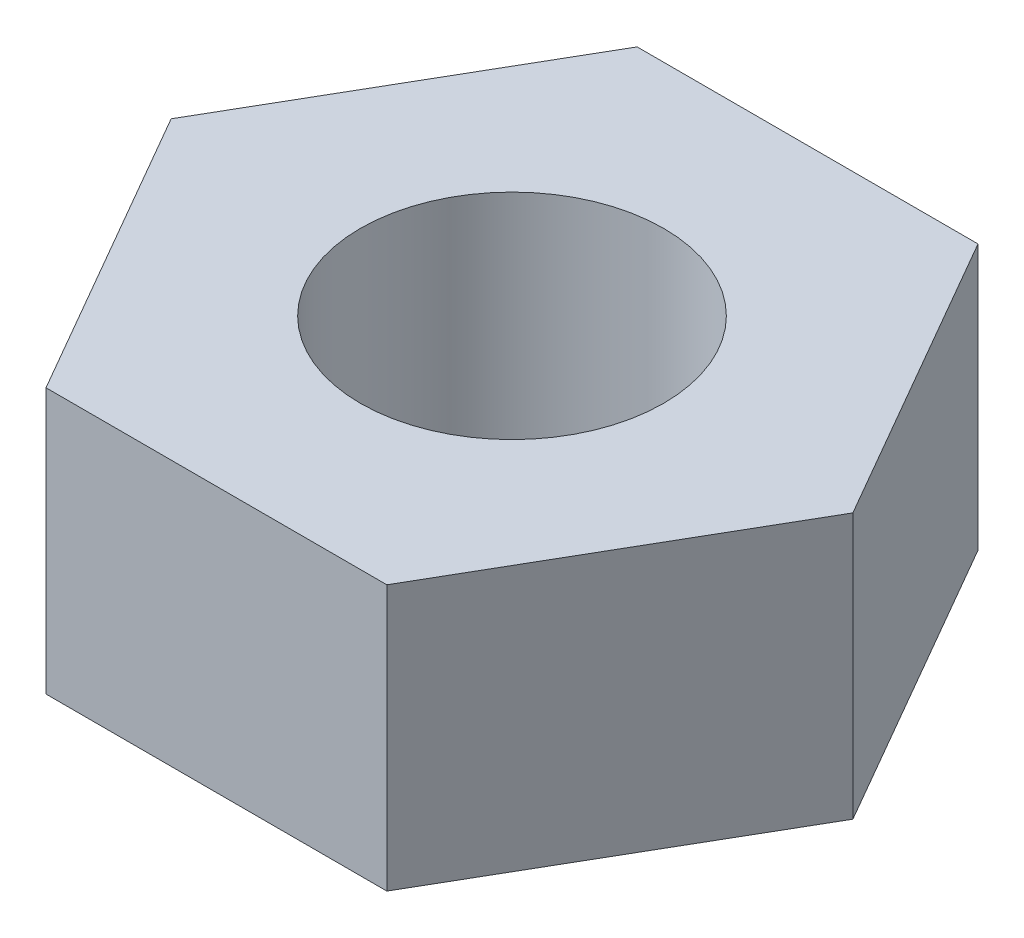
ISO-10303-21;
HEADER;
FILE_DESCRIPTION(('STEP AP214'),'2;1');
FILE_NAME('part.step','',(''),(''),'','','');
FILE_SCHEMA(('AUTOMOTIVE_DESIGN { 1 0 10303 214 1 1 1 1 }'));
ENDSEC;
DATA;
#1=APPLICATION_CONTEXT('core data for automotive mechanical design processes');
#2=APPLICATION_PROTOCOL_DEFINITION('international standard','automotive_design',2000,#1);
#3=PRODUCT_CONTEXT('',#1,'mechanical');
#4=PRODUCT('Part','Part','',(#3));
#5=PRODUCT_RELATED_PRODUCT_CATEGORY('part','',(#4));
#6=PRODUCT_DEFINITION_FORMATION('','',#4);
#7=PRODUCT_DEFINITION_CONTEXT('part definition',#1,'design');
#8=PRODUCT_DEFINITION('design','',#6,#7);
#9=PRODUCT_DEFINITION_SHAPE('','',#8);
#10=(LENGTH_UNIT() NAMED_UNIT(*) SI_UNIT(.MILLI.,.METRE.));
#11=(NAMED_UNIT(*) PLANE_ANGLE_UNIT() SI_UNIT($,.RADIAN.));
#12=(NAMED_UNIT(*) SI_UNIT($,.STERADIAN.) SOLID_ANGLE_UNIT());
#13=UNCERTAINTY_MEASURE_WITH_UNIT(LENGTH_MEASURE(1.E-05),#10,'distance_accuracy_value','');
#14=(GEOMETRIC_REPRESENTATION_CONTEXT(3) GLOBAL_UNCERTAINTY_ASSIGNED_CONTEXT((#13)) GLOBAL_UNIT_ASSIGNED_CONTEXT((#10,
#11,#12)) REPRESENTATION_CONTEXT('',''));
#15=CARTESIAN_POINT('',(0.,0.,0.));
#16=DIRECTION('',(0.,0.,1.));
#17=DIRECTION('',(1.,0.,0.));
#18=AXIS2_PLACEMENT_3D('',#15,#16,#17);
#19=CARTESIAN_POINT('',(8.99025308735562,14.,15.5940805892907));
#20=DIRECTION('',(0.,1.,0.));
#21=DIRECTION('',(0.,0.,1.));
#22=AXIS2_PLACEMENT_3D('',#19,#20,#21);
#23=PLANE('',#22);
#24=DIRECTION('',(0.99999980459252,0.,0.000625151919105333));
#25=VECTOR('',#24,1.);
#26=CARTESIAN_POINT('',(-9.00974339530973,14.,15.5828278547468));
#27=LINE('',#26,#25);
#28=CARTESIAN_POINT('',(-9.00974339530973,14.,15.5828278547468));
#29=VERTEX_POINT('',#28);
#30=CARTESIAN_POINT('',(8.99025308735562,14.,15.5940805892907));
#31=VERTEX_POINT('',#30);
#32=EDGE_CURVE('E127',#29,#31,#27,.T.);
#33=ORIENTED_EDGE('',*,*,#32,.T.);
#34=DIRECTION('',(0.500541299739429,0.,-0.865712658597044));
#35=VECTOR('',#34,1.);
#36=CARTESIAN_POINT('',(8.99025308735562,14.,15.5940805892907));
#37=LINE('',#36,#35);
#38=CARTESIAN_POINT('',(17.9999964826653,14.,0.0112527345438881));
#39=VERTEX_POINT('',#38);
#40=EDGE_CURVE('E85',#31,#39,#37,.T.);
#41=ORIENTED_EDGE('',*,*,#40,.T.);
#42=DIRECTION('',(-0.49945850485309,0.,-0.866337810516149));
#43=VECTOR('',#42,1.);
#44=CARTESIAN_POINT('',(17.9999964826653,14.,0.0112527345438881));
#45=LINE('',#44,#43);
#46=CARTESIAN_POINT('',(9.00974339530972,14.,-15.5828278547468));
#47=VERTEX_POINT('',#46);
#48=EDGE_CURVE('E98',#39,#47,#45,.T.);
#49=ORIENTED_EDGE('',*,*,#48,.T.);
#50=DIRECTION('',(-0.99999980459252,0.,-0.000625151919105237));
#51=VECTOR('',#50,1.);
#52=CARTESIAN_POINT('',(9.00974339530972,14.,-15.5828278547468));
#53=LINE('',#52,#51);
#54=CARTESIAN_POINT('',(-8.99025308735562,14.,-15.5940805892907));
#55=VERTEX_POINT('',#54);
#56=EDGE_CURVE('E92',#47,#55,#53,.T.);
#57=ORIENTED_EDGE('',*,*,#56,.T.);
#58=DIRECTION('',(-0.50054129973943,0.,0.865712658597044));
#59=VECTOR('',#58,1.);
#60=CARTESIAN_POINT('',(-8.99025308735562,14.,-15.5940805892907));
#61=LINE('',#60,#59);
#62=CARTESIAN_POINT('',(-17.9999964826653,14.,-0.011252734543889));
#63=VERTEX_POINT('',#62);
#64=EDGE_CURVE('E96',#55,#63,#61,.T.);
#65=ORIENTED_EDGE('',*,*,#64,.T.);
#66=DIRECTION('',(0.49945850485309,0.,0.86633781051615));
#67=VECTOR('',#66,1.);
#68=CARTESIAN_POINT('',(-17.9999964826653,14.,-0.011252734543889));
#69=LINE('',#68,#67);
#70=EDGE_CURVE('E48',#63,#29,#69,.T.);
#71=ORIENTED_EDGE('',*,*,#70,.T.);
#72=EDGE_LOOP('',(#33,#41,#49,#57,#65,#71));
#73=FACE_BOUND('',#72,.T.);
#74=CARTESIAN_POINT('',(0.,14.,0.));
#75=DIRECTION('',(0.,1.,0.));
#76=DIRECTION('',(0.,0.,1.));
#77=AXIS2_PLACEMENT_3D('',#74,#75,#76);
#78=CIRCLE('',#77,8.);
#79=CARTESIAN_POINT('',(0.,14.,8.));
#80=VERTEX_POINT('',#79);
#81=EDGE_CURVE('E120',#80,#80,#78,.T.);
#82=ORIENTED_EDGE('',*,*,#81,.F.);
#83=EDGE_LOOP('',(#82));
#84=FACE_BOUND('',#83,.T.);
#85=ADVANCED_FACE('F31',(#73,#84),#23,.T.);
#86=CARTESIAN_POINT('',(8.99025308735562,0.,15.5940805892907));
#87=DIRECTION('',(0.,1.,0.));
#88=DIRECTION('',(0.,0.,1.));
#89=AXIS2_PLACEMENT_3D('',#86,#87,#88);
#90=PLANE('',#89);
#91=DIRECTION('',(0.99999980459252,0.,0.000625151919105333));
#92=VECTOR('',#91,1.);
#93=CARTESIAN_POINT('',(-9.00974339530973,0.,15.5828278547468));
#94=LINE('',#93,#92);
#95=CARTESIAN_POINT('',(-9.00974339530973,0.,15.5828278547468));
#96=VERTEX_POINT('',#95);
#97=CARTESIAN_POINT('',(8.99025308735562,0.,15.5940805892907));
#98=VERTEX_POINT('',#97);
#99=EDGE_CURVE('E116',#96,#98,#94,.T.);
#100=ORIENTED_EDGE('',*,*,#99,.F.);
#101=DIRECTION('',(0.49945850485309,0.,0.86633781051615));
#102=VECTOR('',#101,1.);
#103=CARTESIAN_POINT('',(-17.9999964826653,0.,-0.011252734543889));
#104=LINE('',#103,#102);
#105=CARTESIAN_POINT('',(-17.9999964826653,0.,-0.011252734543889));
#106=VERTEX_POINT('',#105);
#107=EDGE_CURVE('E77',#106,#96,#104,.T.);
#108=ORIENTED_EDGE('',*,*,#107,.F.);
#109=DIRECTION('',(-0.50054129973943,0.,0.865712658597044));
#110=VECTOR('',#109,1.);
#111=CARTESIAN_POINT('',(-8.99025308735562,0.,-15.5940805892907));
#112=LINE('',#111,#110);
#113=CARTESIAN_POINT('',(-8.99025308735562,0.,-15.5940805892907));
#114=VERTEX_POINT('',#113);
#115=EDGE_CURVE('E71',#114,#106,#112,.T.);
#116=ORIENTED_EDGE('',*,*,#115,.F.);
#117=DIRECTION('',(-0.99999980459252,0.,-0.000625151919105237));
#118=VECTOR('',#117,1.);
#119=CARTESIAN_POINT('',(9.00974339530972,0.,-15.5828278547468));
#120=LINE('',#119,#118);
#121=CARTESIAN_POINT('',(9.00974339530972,0.,-15.5828278547468));
#122=VERTEX_POINT('',#121);
#123=EDGE_CURVE('E106',#122,#114,#120,.T.);
#124=ORIENTED_EDGE('',*,*,#123,.F.);
#125=DIRECTION('',(-0.49945850485309,0.,-0.866337810516149));
#126=VECTOR('',#125,1.);
#127=CARTESIAN_POINT('',(17.9999964826653,0.,0.0112527345438881));
#128=LINE('',#127,#126);
#129=CARTESIAN_POINT('',(17.9999964826653,0.,0.0112527345438881));
#130=VERTEX_POINT('',#129);
#131=EDGE_CURVE('E122',#130,#122,#128,.T.);
#132=ORIENTED_EDGE('',*,*,#131,.F.);
#133=DIRECTION('',(0.500541299739429,0.,-0.865712658597044));
#134=VECTOR('',#133,1.);
#135=CARTESIAN_POINT('',(8.99025308735562,0.,15.5940805892907));
#136=LINE('',#135,#134);
#137=EDGE_CURVE('E119',#98,#130,#136,.T.);
#138=ORIENTED_EDGE('',*,*,#137,.F.);
#139=EDGE_LOOP('',(#100,#108,#116,#124,#132,#138));
#140=FACE_BOUND('',#139,.T.);
#141=CARTESIAN_POINT('',(0.,0.,0.));
#142=DIRECTION('',(0.,1.,0.));
#143=DIRECTION('',(0.,0.,1.));
#144=AXIS2_PLACEMENT_3D('',#141,#142,#143);
#145=CIRCLE('',#144,8.);
#146=CARTESIAN_POINT('',(0.,0.,8.));
#147=VERTEX_POINT('',#146);
#148=EDGE_CURVE('E220',#147,#147,#145,.T.);
#149=ORIENTED_EDGE('',*,*,#148,.T.);
#150=EDGE_LOOP('',(#149));
#151=FACE_BOUND('',#150,.T.);
#152=ADVANCED_FACE('F136',(#140,#151),#90,.F.);
#153=CARTESIAN_POINT('',(-9.00974339530973,14.,15.5828278547468));
#154=DIRECTION('',(0.000625151919105333,0.,-0.99999980459252));
#155=DIRECTION('',(-0.99999980459252,0.,-0.000625151919105333));
#156=AXIS2_PLACEMENT_3D('',#153,#154,#155);
#157=PLANE('',#156);
#158=ORIENTED_EDGE('',*,*,#99,.T.);
#159=DIRECTION('',(0.,-1.,0.));
#160=VECTOR('',#159,1.);
#161=CARTESIAN_POINT('',(8.99025308735562,14.,15.5940805892907));
#162=LINE('',#161,#160);
#163=EDGE_CURVE('E11',#31,#98,#162,.T.);
#164=ORIENTED_EDGE('',*,*,#163,.F.);
#165=ORIENTED_EDGE('',*,*,#32,.F.);
#166=DIRECTION('',(0.,-1.,0.));
#167=VECTOR('',#166,1.);
#168=CARTESIAN_POINT('',(-9.00974339530973,14.,15.5828278547468));
#169=LINE('',#168,#167);
#170=EDGE_CURVE('E112',#29,#96,#169,.T.);
#171=ORIENTED_EDGE('',*,*,#170,.T.);
#172=EDGE_LOOP('',(#158,#164,#165,#171));
#173=FACE_BOUND('',#172,.T.);
#174=ADVANCED_FACE('F33',(#173),#157,.F.);
#175=CARTESIAN_POINT('',(8.99025308735562,14.,15.5940805892907));
#176=DIRECTION('',(-0.865712658597044,0.,-0.500541299739429));
#177=DIRECTION('',(-0.500541299739429,0.,0.865712658597044));
#178=AXIS2_PLACEMENT_3D('',#175,#176,#177);
#179=PLANE('',#178);
#180=ORIENTED_EDGE('',*,*,#137,.T.);
#181=DIRECTION('',(0.,-1.,0.));
#182=VECTOR('',#181,1.);
#183=CARTESIAN_POINT('',(17.9999964826653,14.,0.0112527345438881));
#184=LINE('',#183,#182);
#185=EDGE_CURVE('E40',#39,#130,#184,.T.);
#186=ORIENTED_EDGE('',*,*,#185,.F.);
#187=ORIENTED_EDGE('',*,*,#40,.F.);
#188=ORIENTED_EDGE('',*,*,#163,.T.);
#189=EDGE_LOOP('',(#180,#186,#187,#188));
#190=FACE_BOUND('',#189,.T.);
#191=ADVANCED_FACE('F161',(#190),#179,.F.);
#192=CARTESIAN_POINT('',(17.9999964826653,14.,0.0112527345438881));
#193=DIRECTION('',(-0.866337810516149,0.,0.49945850485309));
#194=DIRECTION('',(0.49945850485309,0.,0.866337810516149));
#195=AXIS2_PLACEMENT_3D('',#192,#193,#194);
#196=PLANE('',#195);
#197=ORIENTED_EDGE('',*,*,#131,.T.);
#198=DIRECTION('',(0.,-1.,0.));
#199=VECTOR('',#198,1.);
#200=CARTESIAN_POINT('',(9.00974339530972,14.,-15.5828278547468));
#201=LINE('',#200,#199);
#202=EDGE_CURVE('E107',#47,#122,#201,.T.);
#203=ORIENTED_EDGE('',*,*,#202,.F.);
#204=ORIENTED_EDGE('',*,*,#48,.F.);
#205=ORIENTED_EDGE('',*,*,#185,.T.);
#206=EDGE_LOOP('',(#197,#203,#204,#205));
#207=FACE_BOUND('',#206,.T.);
#208=ADVANCED_FACE('F133',(#207),#196,.F.);
#209=CARTESIAN_POINT('',(9.00974339530972,14.,-15.5828278547468));
#210=DIRECTION('',(-0.000625151919105237,0.,0.99999980459252));
#211=DIRECTION('',(0.99999980459252,0.,0.000625151919105237));
#212=AXIS2_PLACEMENT_3D('',#209,#210,#211);
#213=PLANE('',#212);
#214=ORIENTED_EDGE('',*,*,#123,.T.);
#215=DIRECTION('',(0.,-1.,0.));
#216=VECTOR('',#215,1.);
#217=CARTESIAN_POINT('',(-8.99025308735562,14.,-15.5940805892907));
#218=LINE('',#217,#216);
#219=EDGE_CURVE('E103',#55,#114,#218,.T.);
#220=ORIENTED_EDGE('',*,*,#219,.F.);
#221=ORIENTED_EDGE('',*,*,#56,.F.);
#222=ORIENTED_EDGE('',*,*,#202,.T.);
#223=EDGE_LOOP('',(#214,#220,#221,#222));
#224=FACE_BOUND('',#223,.T.);
#225=ADVANCED_FACE('F104',(#224),#213,.F.);
#226=CARTESIAN_POINT('',(-8.99025308735562,14.,-15.5940805892907));
#227=DIRECTION('',(0.865712658597044,0.,0.50054129973943));
#228=DIRECTION('',(0.50054129973943,0.,-0.865712658597044));
#229=AXIS2_PLACEMENT_3D('',#226,#227,#228);
#230=PLANE('',#229);
#231=ORIENTED_EDGE('',*,*,#115,.T.);
#232=DIRECTION('',(0.,-1.,0.));
#233=VECTOR('',#232,1.);
#234=CARTESIAN_POINT('',(-17.9999964826653,14.,-0.011252734543889));
#235=LINE('',#234,#233);
#236=EDGE_CURVE('E108',#63,#106,#235,.T.);
#237=ORIENTED_EDGE('',*,*,#236,.F.);
#238=ORIENTED_EDGE('',*,*,#64,.F.);
#239=ORIENTED_EDGE('',*,*,#219,.T.);
#240=EDGE_LOOP('',(#231,#237,#238,#239));
#241=FACE_BOUND('',#240,.T.);
#242=ADVANCED_FACE('F110',(#241),#230,.F.);
#243=CARTESIAN_POINT('',(-17.9999964826653,14.,-0.011252734543889));
#244=DIRECTION('',(0.866337810516149,0.,-0.49945850485309));
#245=DIRECTION('',(-0.49945850485309,0.,-0.866337810516149));
#246=AXIS2_PLACEMENT_3D('',#243,#244,#245);
#247=PLANE('',#246);
#248=ORIENTED_EDGE('',*,*,#107,.T.);
#249=ORIENTED_EDGE('',*,*,#170,.F.);
#250=ORIENTED_EDGE('',*,*,#70,.F.);
#251=ORIENTED_EDGE('',*,*,#236,.T.);
#252=EDGE_LOOP('',(#248,#249,#250,#251));
#253=FACE_BOUND('',#252,.T.);
#254=ADVANCED_FACE('F141',(#253),#247,.F.);
#255=CARTESIAN_POINT('',(0.,14.,0.));
#256=DIRECTION('',(0.,-1.,0.));
#257=DIRECTION('',(0.,0.,-1.));
#258=AXIS2_PLACEMENT_3D('',#255,#256,#257);
#259=CYLINDRICAL_SURFACE('',#258,8.);
#260=ORIENTED_EDGE('',*,*,#81,.T.);
#261=EDGE_LOOP('',(#260));
#262=FACE_BOUND('',#261,.T.);
#263=ORIENTED_EDGE('',*,*,#148,.F.);
#264=EDGE_LOOP('',(#263));
#265=FACE_BOUND('',#264,.T.);
#266=ADVANCED_FACE('F143',(#262,#265),#259,.F.);
#267=CLOSED_SHELL('',(#85,#152,#174,#191,#208,#225,#242,#254,#266));
#268=MANIFOLD_SOLID_BREP('B2',#267);
#269=ADVANCED_BREP_SHAPE_REPRESENTATION('',(#18,#268),#14);
#270=SHAPE_DEFINITION_REPRESENTATION(#9,#269);
ENDSEC;
END-ISO-10303-21;
